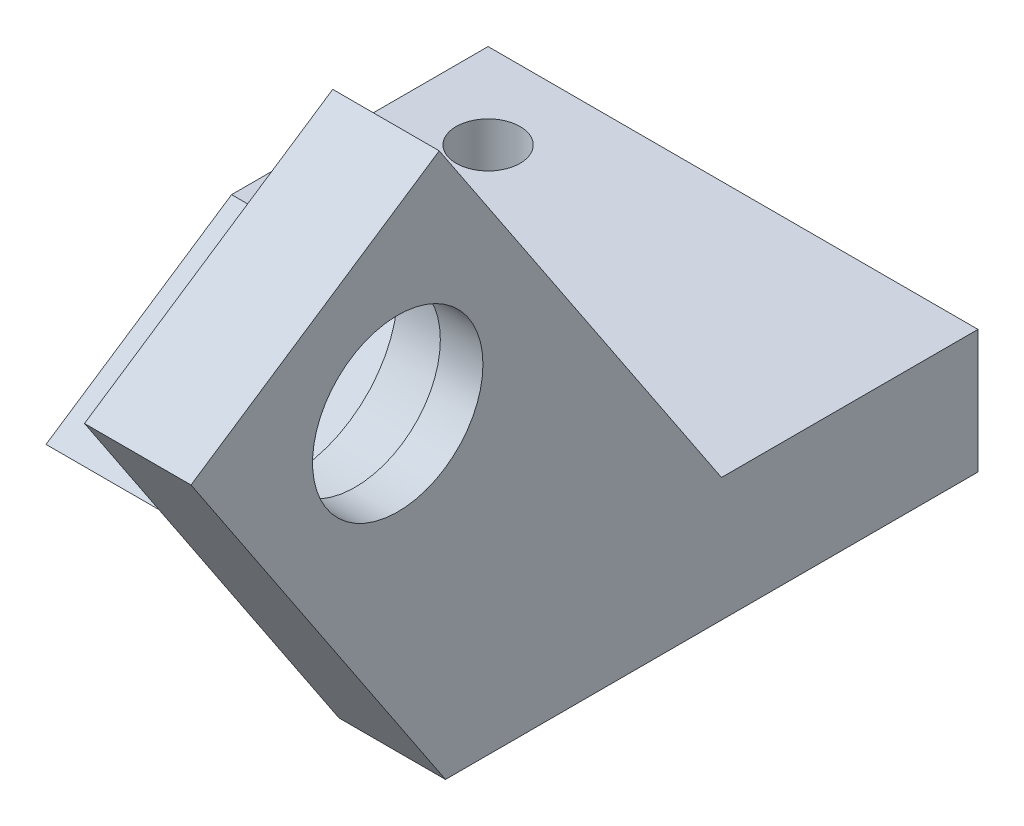
ISO-10303-21;
HEADER;
FILE_DESCRIPTION(('STEP AP214'),'2;1');
FILE_NAME('part.step','',(''),(''),'','','');
FILE_SCHEMA(('AUTOMOTIVE_DESIGN { 1 0 10303 214 1 1 1 1 }'));
ENDSEC;
DATA;
#1=APPLICATION_CONTEXT('core data for automotive mechanical design processes');
#2=APPLICATION_PROTOCOL_DEFINITION('international standard','automotive_design',2000,#1);
#3=PRODUCT_CONTEXT('',#1,'mechanical');
#4=PRODUCT('Part','Part','',(#3));
#5=PRODUCT_RELATED_PRODUCT_CATEGORY('part','',(#4));
#6=PRODUCT_DEFINITION_FORMATION('','',#4);
#7=PRODUCT_DEFINITION_CONTEXT('part definition',#1,'design');
#8=PRODUCT_DEFINITION('design','',#6,#7);
#9=PRODUCT_DEFINITION_SHAPE('','',#8);
#10=(LENGTH_UNIT() NAMED_UNIT(*) SI_UNIT(.MILLI.,.METRE.));
#11=(NAMED_UNIT(*) PLANE_ANGLE_UNIT() SI_UNIT($,.RADIAN.));
#12=(NAMED_UNIT(*) SI_UNIT($,.STERADIAN.) SOLID_ANGLE_UNIT());
#13=UNCERTAINTY_MEASURE_WITH_UNIT(LENGTH_MEASURE(1.E-05),#10,'distance_accuracy_value','');
#14=(GEOMETRIC_REPRESENTATION_CONTEXT(3) GLOBAL_UNCERTAINTY_ASSIGNED_CONTEXT((#13)) GLOBAL_UNIT_ASSIGNED_CONTEXT((#10,
#11,#12)) REPRESENTATION_CONTEXT('',''));
#15=CARTESIAN_POINT('',(0.,0.,0.));
#16=DIRECTION('',(0.,0.,1.));
#17=DIRECTION('',(1.,0.,0.));
#18=AXIS2_PLACEMENT_3D('',#15,#16,#17);
#19=CARTESIAN_POINT('',(0.,0.,0.));
#20=DIRECTION('',(1.,0.,0.));
#21=DIRECTION('',(0.,0.,-1.));
#22=AXIS2_PLACEMENT_3D('',#19,#20,#21);
#23=PLANE('',#22);
#24=DIRECTION('',(0.,0.,-1.));
#25=VECTOR('',#24,1.);
#26=CARTESIAN_POINT('',(0.,0.,-25.));
#27=LINE('',#26,#25);
#28=CARTESIAN_POINT('',(0.,0.,-4.24463236054693));
#29=VERTEX_POINT('',#28);
#30=CARTESIAN_POINT('',(0.,0.,-25.));
#31=VERTEX_POINT('',#30);
#32=EDGE_CURVE('E137',#29,#31,#27,.T.);
#33=ORIENTED_EDGE('',*,*,#32,.F.);
#34=DIRECTION('',(0.,0.554133260159787,-0.832427972850917));
#35=VECTOR('',#34,1.);
#36=CARTESIAN_POINT('',(0.,-1.95794714898904,-1.30337239049531));
#37=LINE('',#36,#35);
#38=CARTESIAN_POINT('',(0.,5.79991849324796,-12.9573640104081));
#39=VERTEX_POINT('',#38);
#40=EDGE_CURVE('E11',#29,#39,#37,.T.);
#41=ORIENTED_EDGE('',*,*,#40,.T.);
#42=DIRECTION('',(0.,0.,1.));
#43=VECTOR('',#42,1.);
#44=CARTESIAN_POINT('',(0.,5.79991849324796,-12.9573640104081));
#45=LINE('',#44,#43);
#46=CARTESIAN_POINT('',(0.,5.79991849324796,-25.));
#47=VERTEX_POINT('',#46);
#48=EDGE_CURVE('E41',#47,#39,#45,.T.);
#49=ORIENTED_EDGE('',*,*,#48,.F.);
#50=DIRECTION('',(0.,1.,0.));
#51=VECTOR('',#50,1.);
#52=CARTESIAN_POINT('',(0.,5.79991849324796,-25.));
#53=LINE('',#52,#51);
#54=EDGE_CURVE('E36',#31,#47,#53,.T.);
#55=ORIENTED_EDGE('',*,*,#54,.F.);
#56=EDGE_LOOP('',(#33,#41,#49,#55));
#57=FACE_BOUND('',#56,.T.);
#58=ADVANCED_FACE('F33',(#57),#23,.F.);
#59=CARTESIAN_POINT('',(23.,5.79991849324796,-12.9573640104081));
#60=DIRECTION('',(0.,-1.,0.));
#61=DIRECTION('',(0.,0.,-1.));
#62=AXIS2_PLACEMENT_3D('',#59,#60,#61);
#63=PLANE('',#62);
#64=CARTESIAN_POINT('',(4.,5.79991849324796,-21.));
#65=DIRECTION('',(0.,-1.,0.));
#66=DIRECTION('',(0.,0.,-1.));
#67=AXIS2_PLACEMENT_3D('',#64,#65,#66);
#68=CIRCLE('',#67,1.49999999999999);
#69=CARTESIAN_POINT('',(4.,5.79991849324796,-22.5));
#70=VERTEX_POINT('',#69);
#71=EDGE_CURVE('E330',#70,#70,#68,.T.);
#72=ORIENTED_EDGE('',*,*,#71,.T.);
#73=EDGE_LOOP('',(#72));
#74=FACE_BOUND('',#73,.T.);
#75=DIRECTION('',(-1.,0.,0.));
#76=VECTOR('',#75,1.);
#77=CARTESIAN_POINT('',(23.,5.79991849324796,-25.));
#78=LINE('',#77,#76);
#79=CARTESIAN_POINT('',(23.,5.79991849324796,-25.));
#80=VERTEX_POINT('',#79);
#81=EDGE_CURVE('E122',#80,#47,#78,.T.);
#82=ORIENTED_EDGE('',*,*,#81,.T.);
#83=ORIENTED_EDGE('',*,*,#48,.T.);
#84=DIRECTION('',(-1.,0.,0.));
#85=VECTOR('',#84,1.);
#86=CARTESIAN_POINT('',(-18.,5.79991849324796,-12.9573640104081));
#87=LINE('',#86,#85);
#88=CARTESIAN_POINT('',(18.,5.79991849324796,-12.9573640104081));
#89=VERTEX_POINT('',#88);
#90=EDGE_CURVE('E97',#89,#39,#87,.T.);
#91=ORIENTED_EDGE('',*,*,#90,.F.);
#92=DIRECTION('',(-1.,0.,0.));
#93=VECTOR('',#92,1.);
#94=CARTESIAN_POINT('',(23.,5.79991849324796,-12.9573640104081));
#95=LINE('',#94,#93);
#96=CARTESIAN_POINT('',(23.,5.79991849324796,-12.9573640104081));
#97=VERTEX_POINT('',#96);
#98=EDGE_CURVE('E117',#97,#89,#95,.T.);
#99=ORIENTED_EDGE('',*,*,#98,.F.);
#100=DIRECTION('',(0.,0.,1.));
#101=VECTOR('',#100,1.);
#102=CARTESIAN_POINT('',(23.,5.79991849324796,-12.9573640104081));
#103=LINE('',#102,#101);
#104=EDGE_CURVE('E145',#80,#97,#103,.T.);
#105=ORIENTED_EDGE('',*,*,#104,.F.);
#106=EDGE_LOOP('',(#82,#83,#91,#99,#105));
#107=FACE_BOUND('',#106,.T.);
#108=ADVANCED_FACE('F115',(#74,#107),#63,.F.);
#109=CARTESIAN_POINT('',(23.,16.,2.24179415327121));
#110=DIRECTION('',(-1.,0.,0.));
#111=DIRECTION('',(0.,0.,1.));
#112=AXIS2_PLACEMENT_3D('',#109,#110,#111);
#113=CYLINDRICAL_SURFACE('',#112,5.);
#114=CARTESIAN_POINT('',(18.,16.,2.24179415327121));
#115=DIRECTION('',(1.,0.,0.));
#116=DIRECTION('',(0.,0.,-1.));
#117=AXIS2_PLACEMENT_3D('',#114,#115,#116);
#118=CIRCLE('',#117,5.);
#119=CARTESIAN_POINT('',(18.,16.,-2.75820584672879));
#120=VERTEX_POINT('',#119);
#121=EDGE_CURVE('E133',#120,#120,#118,.T.);
#122=ORIENTED_EDGE('',*,*,#121,.F.);
#123=EDGE_LOOP('',(#122));
#124=FACE_BOUND('',#123,.T.);
#125=CARTESIAN_POINT('',(21.,16.,2.24179415327121));
#126=DIRECTION('',(1.,0.,0.));
#127=DIRECTION('',(0.,0.,-1.));
#128=AXIS2_PLACEMENT_3D('',#125,#126,#127);
#129=CIRCLE('',#128,5.);
#130=CARTESIAN_POINT('',(21.,16.,-2.75820584672879));
#131=VERTEX_POINT('',#130);
#132=EDGE_CURVE('E170',#131,#131,#129,.T.);
#133=ORIENTED_EDGE('',*,*,#132,.T.);
#134=EDGE_LOOP('',(#133));
#135=FACE_BOUND('',#134,.T.);
#136=ADVANCED_FACE('F198',(#124,#135),#113,.F.);
#137=CARTESIAN_POINT('',(23.,25.7059286310749,0.293731164433303));
#138=DIRECTION('',(0.,-0.554133260159787,0.832427972850916));
#139=DIRECTION('',(0.,-0.832427972850917,-0.554133260159787));
#140=AXIS2_PLACEMENT_3D('',#137,#138,#139);
#141=PLANE('',#140);
#142=ORIENTED_EDGE('',*,*,#98,.T.);
#143=DIRECTION('',(0.,0.832427972850916,0.554133260159787));
#144=VECTOR('',#143,1.);
#145=CARTESIAN_POINT('',(18.,5.79991849324796,-12.9573640104081));
#146=LINE('',#145,#144);
#147=CARTESIAN_POINT('',(18.,25.7059286310749,0.293731164433316));
#148=VERTEX_POINT('',#147);
#149=EDGE_CURVE('E105',#89,#148,#146,.T.);
#150=ORIENTED_EDGE('',*,*,#149,.T.);
#151=DIRECTION('',(-1.,0.,0.));
#152=VECTOR('',#151,1.);
#153=CARTESIAN_POINT('',(23.,25.7059286310749,0.293731164433303));
#154=LINE('',#153,#152);
#155=CARTESIAN_POINT('',(23.,25.7059286310749,0.293731164433303));
#156=VERTEX_POINT('',#155);
#157=EDGE_CURVE('E123',#156,#148,#154,.T.);
#158=ORIENTED_EDGE('',*,*,#157,.F.);
#159=DIRECTION('',(0.,0.832427972850916,0.554133260159787));
#160=VECTOR('',#159,1.);
#161=CARTESIAN_POINT('',(23.,25.7059286310749,0.293731164433303));
#162=LINE('',#161,#160);
#163=EDGE_CURVE('E121',#97,#156,#162,.T.);
#164=ORIENTED_EDGE('',*,*,#163,.F.);
#165=EDGE_LOOP('',(#142,#150,#158,#164));
#166=FACE_BOUND('',#165,.T.);
#167=ADVANCED_FACE('F120',(#166),#141,.F.);
#168=CARTESIAN_POINT('',(23.,17.9480629888379,11.9477227843461));
#169=DIRECTION('',(0.,-0.832427972850917,-0.554133260159787));
#170=DIRECTION('',(0.,0.554133260159787,-0.832427972850917));
#171=AXIS2_PLACEMENT_3D('',#168,#169,#170);
#172=PLANE('',#171);
#173=ORIENTED_EDGE('',*,*,#157,.T.);
#174=DIRECTION('',(0.,0.554133260159787,-0.832427972850917));
#175=VECTOR('',#174,1.);
#176=CARTESIAN_POINT('',(18.,25.7059286310749,0.293731164433316));
#177=LINE('',#176,#175);
#178=CARTESIAN_POINT('',(18.,17.9480629888379,11.9477227843461));
#179=VERTEX_POINT('',#178);
#180=EDGE_CURVE('E102',#179,#148,#177,.T.);
#181=ORIENTED_EDGE('',*,*,#180,.F.);
#182=DIRECTION('',(-1.,0.,0.));
#183=VECTOR('',#182,1.);
#184=CARTESIAN_POINT('',(23.,17.9480629888379,11.9477227843461));
#185=LINE('',#184,#183);
#186=CARTESIAN_POINT('',(23.,17.9480629888379,11.9477227843461));
#187=VERTEX_POINT('',#186);
#188=EDGE_CURVE('E127',#187,#179,#185,.T.);
#189=ORIENTED_EDGE('',*,*,#188,.F.);
#190=DIRECTION('',(0.,-0.554133260159787,0.832427972850916));
#191=VECTOR('',#190,1.);
#192=CARTESIAN_POINT('',(23.,17.9480629888379,11.9477227843461));
#193=LINE('',#192,#191);
#194=EDGE_CURVE('E149',#156,#187,#193,.T.);
#195=ORIENTED_EDGE('',*,*,#194,.F.);
#196=EDGE_LOOP('',(#173,#181,#189,#195));
#197=FACE_BOUND('',#196,.T.);
#198=ADVANCED_FACE('F169',(#197),#172,.F.);
#199=CARTESIAN_POINT('',(23.,0.,0.));
#200=DIRECTION('',(0.,0.554133260159787,-0.832427972850916));
#201=DIRECTION('',(0.,0.832427972850917,0.554133260159787));
#202=AXIS2_PLACEMENT_3D('',#199,#200,#201);
#203=PLANE('',#202);
#204=ORIENTED_EDGE('',*,*,#188,.T.);
#205=DIRECTION('',(0.,0.832427972850916,0.554133260159787));
#206=VECTOR('',#205,1.);
#207=CARTESIAN_POINT('',(18.,-1.95794714898905,-1.30337239049531));
#208=LINE('',#207,#206);
#209=CARTESIAN_POINT('',(18.,0.,0.));
#210=VERTEX_POINT('',#209);
#211=EDGE_CURVE('E112',#210,#179,#208,.T.);
#212=ORIENTED_EDGE('',*,*,#211,.F.);
#213=DIRECTION('',(-1.,0.,0.));
#214=VECTOR('',#213,1.);
#215=CARTESIAN_POINT('',(23.,0.,0.));
#216=LINE('',#215,#214);
#217=CARTESIAN_POINT('',(23.,0.,0.));
#218=VERTEX_POINT('',#217);
#219=EDGE_CURVE('E158',#218,#210,#216,.T.);
#220=ORIENTED_EDGE('',*,*,#219,.F.);
#221=DIRECTION('',(0.,-0.832427972850917,-0.554133260159787));
#222=VECTOR('',#221,1.);
#223=CARTESIAN_POINT('',(23.,0.,0.));
#224=LINE('',#223,#222);
#225=EDGE_CURVE('E156',#187,#218,#224,.T.);
#226=ORIENTED_EDGE('',*,*,#225,.F.);
#227=EDGE_LOOP('',(#204,#212,#220,#226));
#228=FACE_BOUND('',#227,.T.);
#229=ADVANCED_FACE('F165',(#228),#203,.F.);
#230=CARTESIAN_POINT('',(23.,0.,0.));
#231=DIRECTION('',(1.,0.,0.));
#232=DIRECTION('',(0.,0.,-1.));
#233=AXIS2_PLACEMENT_3D('',#230,#231,#232);
#234=PLANE('',#233);
#235=DIRECTION('',(0.,0.,-1.));
#236=VECTOR('',#235,1.);
#237=CARTESIAN_POINT('',(23.,0.,-25.));
#238=LINE('',#237,#236);
#239=CARTESIAN_POINT('',(23.,0.,-25.));
#240=VERTEX_POINT('',#239);
#241=EDGE_CURVE('E151',#218,#240,#238,.T.);
#242=ORIENTED_EDGE('',*,*,#241,.T.);
#243=DIRECTION('',(0.,1.,0.));
#244=VECTOR('',#243,1.);
#245=CARTESIAN_POINT('',(23.,5.79991849324796,-25.));
#246=LINE('',#245,#244);
#247=EDGE_CURVE('E147',#240,#80,#246,.T.);
#248=ORIENTED_EDGE('',*,*,#247,.T.);
#249=ORIENTED_EDGE('',*,*,#104,.T.);
#250=ORIENTED_EDGE('',*,*,#163,.T.);
#251=ORIENTED_EDGE('',*,*,#194,.T.);
#252=ORIENTED_EDGE('',*,*,#225,.T.);
#253=EDGE_LOOP('',(#242,#248,#249,#250,#251,#252));
#254=FACE_BOUND('',#253,.T.);
#255=CARTESIAN_POINT('',(23.,16.,2.24179415327121));
#256=DIRECTION('',(1.,0.,0.));
#257=DIRECTION('',(0.,0.,-1.));
#258=AXIS2_PLACEMENT_3D('',#255,#256,#257);
#259=CIRCLE('',#258,4.);
#260=CARTESIAN_POINT('',(23.,16.,-1.75820584672879));
#261=VERTEX_POINT('',#260);
#262=EDGE_CURVE('E327',#261,#261,#259,.T.);
#263=ORIENTED_EDGE('',*,*,#262,.F.);
#264=EDGE_LOOP('',(#263));
#265=FACE_BOUND('',#264,.T.);
#266=ADVANCED_FACE('F180',(#254,#265),#234,.T.);
#267=CARTESIAN_POINT('',(23.,0.,-25.));
#268=DIRECTION('',(0.,1.,0.));
#269=DIRECTION('',(0.,0.,1.));
#270=AXIS2_PLACEMENT_3D('',#267,#268,#269);
#271=PLANE('',#270);
#272=CARTESIAN_POINT('',(15.,0.,-11.244632360547));
#273=DIRECTION('',(0.,-1.,0.));
#274=DIRECTION('',(0.,0.,-1.));
#275=AXIS2_PLACEMENT_3D('',#272,#273,#274);
#276=CIRCLE('',#275,1.49999999999999);
#277=CARTESIAN_POINT('',(15.,0.,-12.744632360547));
#278=VERTEX_POINT('',#277);
#279=EDGE_CURVE('E340',#278,#278,#276,.T.);
#280=ORIENTED_EDGE('',*,*,#279,.F.);
#281=EDGE_LOOP('',(#280));
#282=FACE_BOUND('',#281,.T.);
#283=CARTESIAN_POINT('',(4.,0.,-21.));
#284=DIRECTION('',(0.,-1.,0.));
#285=DIRECTION('',(0.,0.,-1.));
#286=AXIS2_PLACEMENT_3D('',#283,#284,#285);
#287=CIRCLE('',#286,1.49999999999999);
#288=CARTESIAN_POINT('',(4.,0.,-22.5));
#289=VERTEX_POINT('',#288);
#290=EDGE_CURVE('E335',#289,#289,#287,.T.);
#291=ORIENTED_EDGE('',*,*,#290,.F.);
#292=EDGE_LOOP('',(#291));
#293=FACE_BOUND('',#292,.T.);
#294=DIRECTION('',(1.,0.,0.));
#295=VECTOR('',#294,1.);
#296=CARTESIAN_POINT('',(23.,0.,-4.24463236054693));
#297=LINE('',#296,#295);
#298=CARTESIAN_POINT('',(18.,0.,-4.24463236054693));
#299=VERTEX_POINT('',#298);
#300=EDGE_CURVE('E99',#29,#299,#297,.T.);
#301=ORIENTED_EDGE('',*,*,#300,.F.);
#302=ORIENTED_EDGE('',*,*,#32,.T.);
#303=DIRECTION('',(-1.,0.,0.));
#304=VECTOR('',#303,1.);
#305=CARTESIAN_POINT('',(23.,0.,-25.));
#306=LINE('',#305,#304);
#307=EDGE_CURVE('E125',#240,#31,#306,.T.);
#308=ORIENTED_EDGE('',*,*,#307,.F.);
#309=ORIENTED_EDGE('',*,*,#241,.F.);
#310=ORIENTED_EDGE('',*,*,#219,.T.);
#311=DIRECTION('',(0.,0.,-1.));
#312=VECTOR('',#311,1.);
#313=CARTESIAN_POINT('',(18.,0.,-25.));
#314=LINE('',#313,#312);
#315=EDGE_CURVE('E135',#210,#299,#314,.T.);
#316=ORIENTED_EDGE('',*,*,#315,.T.);
#317=EDGE_LOOP('',(#301,#302,#308,#309,#310,#316));
#318=FACE_BOUND('',#317,.T.);
#319=ADVANCED_FACE('F182',(#282,#293,#318),#271,.F.);
#320=CARTESIAN_POINT('',(23.,5.79991849324796,-25.));
#321=DIRECTION('',(0.,0.,1.));
#322=DIRECTION('',(1.,0.,0.));
#323=AXIS2_PLACEMENT_3D('',#320,#321,#322);
#324=PLANE('',#323);
#325=ORIENTED_EDGE('',*,*,#307,.T.);
#326=ORIENTED_EDGE('',*,*,#54,.T.);
#327=ORIENTED_EDGE('',*,*,#81,.F.);
#328=ORIENTED_EDGE('',*,*,#247,.F.);
#329=EDGE_LOOP('',(#325,#326,#327,#328));
#330=FACE_BOUND('',#329,.T.);
#331=ADVANCED_FACE('F143',(#330),#324,.F.);
#332=CARTESIAN_POINT('',(0.,-1.95794714898904,-1.30337239049531));
#333=DIRECTION('',(0.,0.832427972850917,0.554133260159787));
#334=DIRECTION('',(0.,-0.554133260159787,0.832427972850917));
#335=AXIS2_PLACEMENT_3D('',#332,#333,#334);
#336=PLANE('',#335);
#337=ORIENTED_EDGE('',*,*,#40,.F.);
#338=ORIENTED_EDGE('',*,*,#300,.T.);
#339=DIRECTION('',(0.,0.554133260159787,-0.832427972850917));
#340=VECTOR('',#339,1.);
#341=CARTESIAN_POINT('',(18.,5.79991849324796,-12.9573640104081));
#342=LINE('',#341,#340);
#343=EDGE_CURVE('E93',#299,#89,#342,.T.);
#344=ORIENTED_EDGE('',*,*,#343,.T.);
#345=ORIENTED_EDGE('',*,*,#90,.T.);
#346=EDGE_LOOP('',(#337,#338,#344,#345));
#347=FACE_BOUND('',#346,.T.);
#348=CARTESIAN_POINT('',(15.,4.65978192423529,-11.244632360547));
#349=DIRECTION('',(0.,0.832427972850917,0.554133260159787));
#350=DIRECTION('',(0.,-0.554133260159787,0.832427972850917));
#351=AXIS2_PLACEMENT_3D('',#348,#349,#350);
#352=ELLIPSE('',#351,1.80195770555711,1.49999999999999);
#353=CARTESIAN_POINT('',(15.,3.66125722618488,-9.74463236054698));
#354=VERTEX_POINT('',#353);
#355=EDGE_CURVE('E338',#354,#354,#352,.T.);
#356=ORIENTED_EDGE('',*,*,#355,.F.);
#357=EDGE_LOOP('',(#356));
#358=FACE_BOUND('',#357,.T.);
#359=ADVANCED_FACE('F95',(#347,#358),#336,.T.);
#360=CARTESIAN_POINT('',(18.,5.79991849324796,-12.9573640104081));
#361=DIRECTION('',(1.,0.,0.));
#362=DIRECTION('',(0.,0.,-1.));
#363=AXIS2_PLACEMENT_3D('',#360,#361,#362);
#364=PLANE('',#363);
#365=ORIENTED_EDGE('',*,*,#121,.T.);
#366=EDGE_LOOP('',(#365));
#367=FACE_BOUND('',#366,.T.);
#368=ORIENTED_EDGE('',*,*,#211,.T.);
#369=ORIENTED_EDGE('',*,*,#180,.T.);
#370=ORIENTED_EDGE('',*,*,#149,.F.);
#371=ORIENTED_EDGE('',*,*,#343,.F.);
#372=ORIENTED_EDGE('',*,*,#315,.F.);
#373=EDGE_LOOP('',(#368,#369,#370,#371,#372));
#374=FACE_BOUND('',#373,.T.);
#375=ADVANCED_FACE('F106',(#367,#374),#364,.F.);
#376=CARTESIAN_POINT('',(21.,16.,2.24179415327121));
#377=DIRECTION('',(1.,0.,0.));
#378=DIRECTION('',(0.,0.,-1.));
#379=AXIS2_PLACEMENT_3D('',#376,#377,#378);
#380=PLANE('',#379);
#381=CARTESIAN_POINT('',(21.,16.,2.24179415327121));
#382=DIRECTION('',(1.,0.,0.));
#383=DIRECTION('',(0.,0.,-1.));
#384=AXIS2_PLACEMENT_3D('',#381,#382,#383);
#385=CIRCLE('',#384,4.);
#386=CARTESIAN_POINT('',(21.,16.,-1.75820584672879));
#387=VERTEX_POINT('',#386);
#388=EDGE_CURVE('E173',#387,#387,#385,.T.);
#389=ORIENTED_EDGE('',*,*,#388,.T.);
#390=EDGE_LOOP('',(#389));
#391=FACE_BOUND('',#390,.T.);
#392=ORIENTED_EDGE('',*,*,#132,.F.);
#393=EDGE_LOOP('',(#392));
#394=FACE_BOUND('',#393,.T.);
#395=ADVANCED_FACE('F216',(#391,#394),#380,.F.);
#396=CARTESIAN_POINT('',(21.,16.,2.24179415327121));
#397=DIRECTION('',(1.,0.,0.));
#398=DIRECTION('',(0.,0.,-1.));
#399=AXIS2_PLACEMENT_3D('',#396,#397,#398);
#400=CYLINDRICAL_SURFACE('',#399,4.);
#401=ORIENTED_EDGE('',*,*,#388,.F.);
#402=EDGE_LOOP('',(#401));
#403=FACE_BOUND('',#402,.T.);
#404=ORIENTED_EDGE('',*,*,#262,.T.);
#405=EDGE_LOOP('',(#404));
#406=FACE_BOUND('',#405,.T.);
#407=ADVANCED_FACE('F208',(#403,#406),#400,.F.);
#408=CARTESIAN_POINT('',(4.,0.,-21.));
#409=DIRECTION('',(0.,-1.,0.));
#410=DIRECTION('',(0.,0.,-1.));
#411=AXIS2_PLACEMENT_3D('',#408,#409,#410);
#412=CYLINDRICAL_SURFACE('',#411,1.49999999999999);
#413=ORIENTED_EDGE('',*,*,#290,.T.);
#414=EDGE_LOOP('',(#413));
#415=FACE_BOUND('',#414,.T.);
#416=ORIENTED_EDGE('',*,*,#71,.F.);
#417=EDGE_LOOP('',(#416));
#418=FACE_BOUND('',#417,.T.);
#419=ADVANCED_FACE('F202',(#415,#418),#412,.F.);
#420=CARTESIAN_POINT('',(15.,0.,-11.244632360547));
#421=DIRECTION('',(0.,-1.,0.));
#422=DIRECTION('',(0.,0.,-1.));
#423=AXIS2_PLACEMENT_3D('',#420,#421,#422);
#424=CYLINDRICAL_SURFACE('',#423,1.49999999999999);
#425=ORIENTED_EDGE('',*,*,#355,.T.);
#426=EDGE_LOOP('',(#425));
#427=FACE_BOUND('',#426,.T.);
#428=ORIENTED_EDGE('',*,*,#279,.T.);
#429=EDGE_LOOP('',(#428));
#430=FACE_BOUND('',#429,.T.);
#431=ADVANCED_FACE('F194',(#427,#430),#424,.F.);
#432=CLOSED_SHELL('',(#58,#108,#136,#167,#198,#229,#266,#319,#331,#359,#375,#395,#407,#419,#431));
#433=MANIFOLD_SOLID_BREP('B2',#432);
#434=ADVANCED_BREP_SHAPE_REPRESENTATION('',(#18,#433),#14);
#435=SHAPE_DEFINITION_REPRESENTATION(#9,#434);
ENDSEC;
END-ISO-10303-21;
